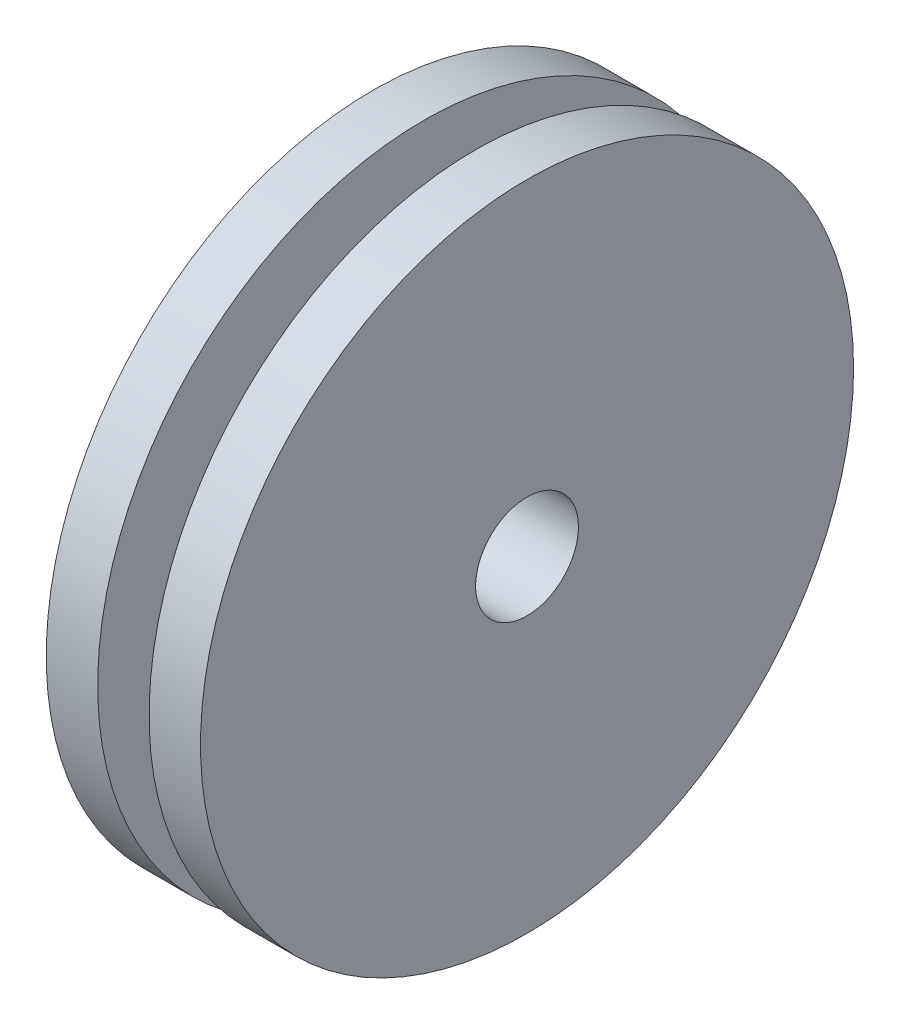
ISO-10303-21;
HEADER;
FILE_DESCRIPTION(('STEP AP214'),'2;1');
FILE_NAME('part.step','',(''),(''),'','','');
FILE_SCHEMA(('AUTOMOTIVE_DESIGN { 1 0 10303 214 1 1 1 1 }'));
ENDSEC;
DATA;
#1=APPLICATION_CONTEXT('core data for automotive mechanical design processes');
#2=APPLICATION_PROTOCOL_DEFINITION('international standard','automotive_design',2000,#1);
#3=PRODUCT_CONTEXT('',#1,'mechanical');
#4=PRODUCT('Part','Part','',(#3));
#5=PRODUCT_RELATED_PRODUCT_CATEGORY('part','',(#4));
#6=PRODUCT_DEFINITION_FORMATION('','',#4);
#7=PRODUCT_DEFINITION_CONTEXT('part definition',#1,'design');
#8=PRODUCT_DEFINITION('design','',#6,#7);
#9=PRODUCT_DEFINITION_SHAPE('','',#8);
#10=(LENGTH_UNIT() NAMED_UNIT(*) SI_UNIT(.MILLI.,.METRE.));
#11=(NAMED_UNIT(*) PLANE_ANGLE_UNIT() SI_UNIT($,.RADIAN.));
#12=(NAMED_UNIT(*) SI_UNIT($,.STERADIAN.) SOLID_ANGLE_UNIT());
#13=UNCERTAINTY_MEASURE_WITH_UNIT(LENGTH_MEASURE(1.E-05),#10,'distance_accuracy_value','');
#14=(GEOMETRIC_REPRESENTATION_CONTEXT(3) GLOBAL_UNCERTAINTY_ASSIGNED_CONTEXT((#13)) GLOBAL_UNIT_ASSIGNED_CONTEXT((#10,
#11,#12)) REPRESENTATION_CONTEXT('',''));
#15=CARTESIAN_POINT('',(0.,0.,0.));
#16=DIRECTION('',(0.,0.,1.));
#17=DIRECTION('',(1.,0.,0.));
#18=AXIS2_PLACEMENT_3D('',#15,#16,#17);
#19=CARTESIAN_POINT('',(6.,4.,0.));
#20=DIRECTION('',(1.,0.,0.));
#21=DIRECTION('',(0.,0.,-1.));
#22=AXIS2_PLACEMENT_3D('',#19,#20,#21);
#23=PLANE('',#22);
#24=CARTESIAN_POINT('',(6.,0.,0.));
#25=DIRECTION('',(1.,0.,0.));
#26=DIRECTION('',(0.,0.,-1.));
#27=AXIS2_PLACEMENT_3D('',#24,#25,#26);
#28=CIRCLE('',#27,25.4);
#29=CARTESIAN_POINT('',(6.,0.,-25.4));
#30=VERTEX_POINT('',#29);
#31=EDGE_CURVE('E12',#30,#30,#28,.T.);
#32=ORIENTED_EDGE('',*,*,#31,.T.);
#33=EDGE_LOOP('',(#32));
#34=FACE_BOUND('',#33,.T.);
#35=CARTESIAN_POINT('',(6.,0.,0.));
#36=DIRECTION('',(1.,0.,0.));
#37=DIRECTION('',(0.,0.,-1.));
#38=AXIS2_PLACEMENT_3D('',#35,#36,#37);
#39=CIRCLE('',#38,4.);
#40=CARTESIAN_POINT('',(6.,0.,-4.));
#41=VERTEX_POINT('',#40);
#42=EDGE_CURVE('E70',#41,#41,#39,.T.);
#43=ORIENTED_EDGE('',*,*,#42,.F.);
#44=EDGE_LOOP('',(#43));
#45=FACE_BOUND('',#44,.T.);
#46=ADVANCED_FACE('F42',(#34,#45),#23,.T.);
#47=CARTESIAN_POINT('',(0.,0.,0.));
#48=DIRECTION('',(1.,0.,0.));
#49=DIRECTION('',(0.,0.,-1.));
#50=AXIS2_PLACEMENT_3D('',#47,#48,#49);
#51=CYLINDRICAL_SURFACE('',#50,25.4);
#52=CARTESIAN_POINT('',(2.,0.,0.));
#53=DIRECTION('',(1.,0.,0.));
#54=DIRECTION('',(0.,0.,-1.));
#55=AXIS2_PLACEMENT_3D('',#52,#53,#54);
#56=CIRCLE('',#55,25.4);
#57=CARTESIAN_POINT('',(2.,0.,-25.4));
#58=VERTEX_POINT('',#57);
#59=EDGE_CURVE('E48',#58,#58,#56,.T.);
#60=ORIENTED_EDGE('',*,*,#59,.T.);
#61=EDGE_LOOP('',(#60));
#62=FACE_BOUND('',#61,.T.);
#63=ORIENTED_EDGE('',*,*,#31,.F.);
#64=EDGE_LOOP('',(#63));
#65=FACE_BOUND('',#64,.T.);
#66=ADVANCED_FACE('F78',(#62,#65),#51,.T.);
#67=CARTESIAN_POINT('',(2.,25.4,0.));
#68=DIRECTION('',(-1.,0.,0.));
#69=DIRECTION('',(0.,0.,1.));
#70=AXIS2_PLACEMENT_3D('',#67,#68,#69);
#71=PLANE('',#70);
#72=CARTESIAN_POINT('',(2.,0.,0.));
#73=DIRECTION('',(1.,0.,0.));
#74=DIRECTION('',(0.,0.,-1.));
#75=AXIS2_PLACEMENT_3D('',#72,#73,#74);
#76=CIRCLE('',#75,19.4);
#77=CARTESIAN_POINT('',(2.,0.,-19.4));
#78=VERTEX_POINT('',#77);
#79=EDGE_CURVE('E52',#78,#78,#76,.T.);
#80=ORIENTED_EDGE('',*,*,#79,.T.);
#81=EDGE_LOOP('',(#80));
#82=FACE_BOUND('',#81,.T.);
#83=ORIENTED_EDGE('',*,*,#59,.F.);
#84=EDGE_LOOP('',(#83));
#85=FACE_BOUND('',#84,.T.);
#86=ADVANCED_FACE('F82',(#82,#85),#71,.T.);
#87=CARTESIAN_POINT('',(0.,0.,0.));
#88=DIRECTION('',(1.,0.,0.));
#89=DIRECTION('',(0.,0.,-1.));
#90=AXIS2_PLACEMENT_3D('',#87,#88,#89);
#91=CYLINDRICAL_SURFACE('',#90,19.4);
#92=CARTESIAN_POINT('',(-2.,0.,0.));
#93=DIRECTION('',(1.,0.,0.));
#94=DIRECTION('',(0.,0.,-1.));
#95=AXIS2_PLACEMENT_3D('',#92,#93,#94);
#96=CIRCLE('',#95,19.4);
#97=CARTESIAN_POINT('',(-2.,0.,-19.4));
#98=VERTEX_POINT('',#97);
#99=EDGE_CURVE('E56',#98,#98,#96,.T.);
#100=ORIENTED_EDGE('',*,*,#99,.T.);
#101=EDGE_LOOP('',(#100));
#102=FACE_BOUND('',#101,.T.);
#103=ORIENTED_EDGE('',*,*,#79,.F.);
#104=EDGE_LOOP('',(#103));
#105=FACE_BOUND('',#104,.T.);
#106=ADVANCED_FACE('F86',(#102,#105),#91,.T.);
#107=CARTESIAN_POINT('',(-2.,25.4,0.));
#108=DIRECTION('',(1.,0.,0.));
#109=DIRECTION('',(0.,0.,-1.));
#110=AXIS2_PLACEMENT_3D('',#107,#108,#109);
#111=PLANE('',#110);
#112=CARTESIAN_POINT('',(-2.,0.,0.));
#113=DIRECTION('',(1.,0.,0.));
#114=DIRECTION('',(0.,0.,-1.));
#115=AXIS2_PLACEMENT_3D('',#112,#113,#114);
#116=CIRCLE('',#115,25.4);
#117=CARTESIAN_POINT('',(-2.,0.,-25.4));
#118=VERTEX_POINT('',#117);
#119=EDGE_CURVE('E61',#118,#118,#116,.T.);
#120=ORIENTED_EDGE('',*,*,#119,.T.);
#121=EDGE_LOOP('',(#120));
#122=FACE_BOUND('',#121,.T.);
#123=ORIENTED_EDGE('',*,*,#99,.F.);
#124=EDGE_LOOP('',(#123));
#125=FACE_BOUND('',#124,.T.);
#126=ADVANCED_FACE('F93',(#122,#125),#111,.T.);
#127=CARTESIAN_POINT('',(0.,0.,0.));
#128=DIRECTION('',(1.,0.,0.));
#129=DIRECTION('',(0.,0.,-1.));
#130=AXIS2_PLACEMENT_3D('',#127,#128,#129);
#131=CYLINDRICAL_SURFACE('',#130,25.4);
#132=CARTESIAN_POINT('',(-6.,0.,0.));
#133=DIRECTION('',(1.,0.,0.));
#134=DIRECTION('',(0.,0.,-1.));
#135=AXIS2_PLACEMENT_3D('',#132,#133,#134);
#136=CIRCLE('',#135,25.4);
#137=CARTESIAN_POINT('',(-6.,0.,-25.4));
#138=VERTEX_POINT('',#137);
#139=EDGE_CURVE('E64',#138,#138,#136,.T.);
#140=ORIENTED_EDGE('',*,*,#139,.T.);
#141=EDGE_LOOP('',(#140));
#142=FACE_BOUND('',#141,.T.);
#143=ORIENTED_EDGE('',*,*,#119,.F.);
#144=EDGE_LOOP('',(#143));
#145=FACE_BOUND('',#144,.T.);
#146=ADVANCED_FACE('F97',(#142,#145),#131,.T.);
#147=CARTESIAN_POINT('',(-6.,4.,0.));
#148=DIRECTION('',(-1.,0.,0.));
#149=DIRECTION('',(0.,0.,1.));
#150=AXIS2_PLACEMENT_3D('',#147,#148,#149);
#151=PLANE('',#150);
#152=CARTESIAN_POINT('',(-6.,0.,0.));
#153=DIRECTION('',(1.,0.,0.));
#154=DIRECTION('',(0.,0.,-1.));
#155=AXIS2_PLACEMENT_3D('',#152,#153,#154);
#156=CIRCLE('',#155,4.);
#157=CARTESIAN_POINT('',(-6.,0.,-4.));
#158=VERTEX_POINT('',#157);
#159=EDGE_CURVE('E67',#158,#158,#156,.T.);
#160=ORIENTED_EDGE('',*,*,#159,.T.);
#161=EDGE_LOOP('',(#160));
#162=FACE_BOUND('',#161,.T.);
#163=ORIENTED_EDGE('',*,*,#139,.F.);
#164=EDGE_LOOP('',(#163));
#165=FACE_BOUND('',#164,.T.);
#166=ADVANCED_FACE('F101',(#162,#165),#151,.T.);
#167=CARTESIAN_POINT('',(0.,0.,0.));
#168=DIRECTION('',(1.,0.,0.));
#169=DIRECTION('',(0.,0.,-1.));
#170=AXIS2_PLACEMENT_3D('',#167,#168,#169);
#171=CYLINDRICAL_SURFACE('',#170,4.);
#172=ORIENTED_EDGE('',*,*,#42,.T.);
#173=EDGE_LOOP('',(#172));
#174=FACE_BOUND('',#173,.T.);
#175=ORIENTED_EDGE('',*,*,#159,.F.);
#176=EDGE_LOOP('',(#175));
#177=FACE_BOUND('',#176,.T.);
#178=ADVANCED_FACE('F74',(#174,#177),#171,.F.);
#179=CLOSED_SHELL('',(#46,#66,#86,#106,#126,#146,#166,#178));
#180=MANIFOLD_SOLID_BREP('B2',#179);
#181=ADVANCED_BREP_SHAPE_REPRESENTATION('',(#18,#180),#14);
#182=SHAPE_DEFINITION_REPRESENTATION(#9,#181);
ENDSEC;
END-ISO-10303-21;
